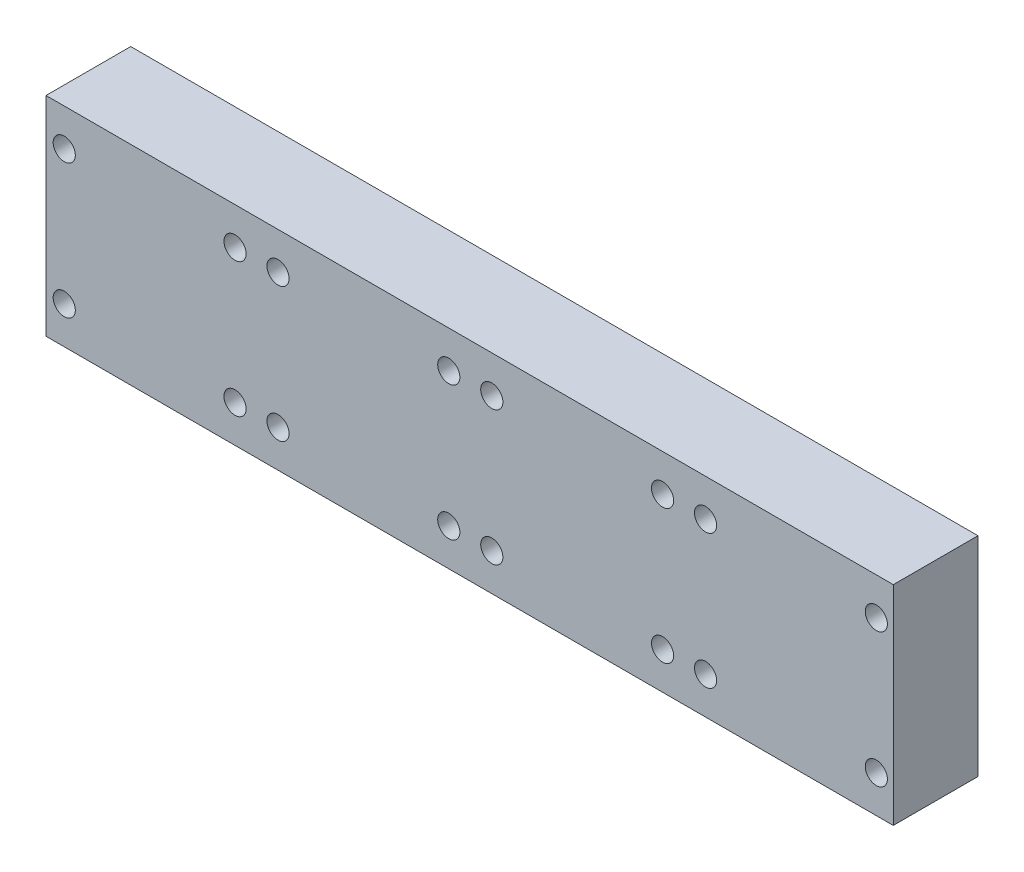
ISO-10303-21;
HEADER;
FILE_DESCRIPTION(('STEP AP214'),'2;1');
FILE_NAME('part.step','',(''),(''),'','','');
FILE_SCHEMA(('AUTOMOTIVE_DESIGN { 1 0 10303 214 1 1 1 1 }'));
ENDSEC;
DATA;
#1=APPLICATION_CONTEXT('core data for automotive mechanical design processes');
#2=APPLICATION_PROTOCOL_DEFINITION('international standard','automotive_design',2000,#1);
#3=PRODUCT_CONTEXT('',#1,'mechanical');
#4=PRODUCT('Part','Part','',(#3));
#5=PRODUCT_RELATED_PRODUCT_CATEGORY('part','',(#4));
#6=PRODUCT_DEFINITION_FORMATION('','',#4);
#7=PRODUCT_DEFINITION_CONTEXT('part definition',#1,'design');
#8=PRODUCT_DEFINITION('design','',#6,#7);
#9=PRODUCT_DEFINITION_SHAPE('','',#8);
#10=(LENGTH_UNIT() NAMED_UNIT(*) SI_UNIT(.MILLI.,.METRE.));
#11=(NAMED_UNIT(*) PLANE_ANGLE_UNIT() SI_UNIT($,.RADIAN.));
#12=(NAMED_UNIT(*) SI_UNIT($,.STERADIAN.) SOLID_ANGLE_UNIT());
#13=UNCERTAINTY_MEASURE_WITH_UNIT(LENGTH_MEASURE(1.E-05),#10,'distance_accuracy_value','');
#14=(GEOMETRIC_REPRESENTATION_CONTEXT(3) GLOBAL_UNCERTAINTY_ASSIGNED_CONTEXT((#13)) GLOBAL_UNIT_ASSIGNED_CONTEXT((#10,
#11,#12)) REPRESENTATION_CONTEXT('',''));
#15=CARTESIAN_POINT('',(0.,0.,0.));
#16=DIRECTION('',(0.,0.,1.));
#17=DIRECTION('',(1.,0.,0.));
#18=AXIS2_PLACEMENT_3D('',#15,#16,#17);
#19=CARTESIAN_POINT('',(127.4,26.3,13.));
#20=DIRECTION('',(0.,0.,1.));
#21=DIRECTION('',(1.,0.,0.));
#22=AXIS2_PLACEMENT_3D('',#19,#20,#21);
#23=CYLINDRICAL_SURFACE('',#22,1.69999999999999);
#24=CARTESIAN_POINT('',(127.4,26.3,0.));
#25=DIRECTION('',(0.,0.,1.));
#26=DIRECTION('',(1.,0.,0.));
#27=AXIS2_PLACEMENT_3D('',#24,#25,#26);
#28=CIRCLE('',#27,1.7);
#29=CARTESIAN_POINT('',(129.1,26.3,0.));
#30=VERTEX_POINT('',#29);
#31=EDGE_CURVE('E48',#30,#30,#28,.T.);
#32=ORIENTED_EDGE('',*,*,#31,.F.);
#33=EDGE_LOOP('',(#32));
#34=FACE_BOUND('',#33,.T.);
#35=CARTESIAN_POINT('',(127.4,26.3,13.));
#36=DIRECTION('',(0.,0.,1.));
#37=DIRECTION('',(1.,0.,0.));
#38=AXIS2_PLACEMENT_3D('',#35,#36,#37);
#39=CIRCLE('',#38,1.69999999999999);
#40=CARTESIAN_POINT('',(129.1,26.3,13.));
#41=VERTEX_POINT('',#40);
#42=EDGE_CURVE('E11',#41,#41,#39,.T.);
#43=ORIENTED_EDGE('',*,*,#42,.T.);
#44=EDGE_LOOP('',(#43));
#45=FACE_BOUND('',#44,.T.);
#46=ADVANCED_FACE('F39',(#34,#45),#23,.F.);
#47=CARTESIAN_POINT('',(94.6,26.3,13.));
#48=DIRECTION('',(0.,0.,1.));
#49=DIRECTION('',(1.,0.,0.));
#50=AXIS2_PLACEMENT_3D('',#47,#48,#49);
#51=CYLINDRICAL_SURFACE('',#50,1.69999999999999);
#52=CARTESIAN_POINT('',(94.6,26.3,0.));
#53=DIRECTION('',(0.,0.,1.));
#54=DIRECTION('',(1.,0.,0.));
#55=AXIS2_PLACEMENT_3D('',#52,#53,#54);
#56=CIRCLE('',#55,1.7);
#57=CARTESIAN_POINT('',(96.3,26.3,0.));
#58=VERTEX_POINT('',#57);
#59=EDGE_CURVE('E177',#58,#58,#56,.T.);
#60=ORIENTED_EDGE('',*,*,#59,.F.);
#61=EDGE_LOOP('',(#60));
#62=FACE_BOUND('',#61,.T.);
#63=CARTESIAN_POINT('',(94.6,26.3,13.));
#64=DIRECTION('',(0.,0.,1.));
#65=DIRECTION('',(1.,0.,0.));
#66=AXIS2_PLACEMENT_3D('',#63,#64,#65);
#67=CIRCLE('',#66,1.69999999999999);
#68=CARTESIAN_POINT('',(96.3,26.3,13.));
#69=VERTEX_POINT('',#68);
#70=EDGE_CURVE('E181',#69,#69,#67,.T.);
#71=ORIENTED_EDGE('',*,*,#70,.T.);
#72=EDGE_LOOP('',(#71));
#73=FACE_BOUND('',#72,.T.);
#74=ADVANCED_FACE('F192',(#62,#73),#51,.F.);
#75=CARTESIAN_POINT('',(101.2,5.7,13.));
#76=DIRECTION('',(0.,0.,1.));
#77=DIRECTION('',(1.,0.,0.));
#78=AXIS2_PLACEMENT_3D('',#75,#76,#77);
#79=CYLINDRICAL_SURFACE('',#78,1.69999999999999);
#80=CARTESIAN_POINT('',(101.2,5.7,0.));
#81=DIRECTION('',(0.,0.,1.));
#82=DIRECTION('',(1.,0.,0.));
#83=AXIS2_PLACEMENT_3D('',#80,#81,#82);
#84=CIRCLE('',#83,1.7);
#85=CARTESIAN_POINT('',(102.9,5.7,0.));
#86=VERTEX_POINT('',#85);
#87=EDGE_CURVE('E169',#86,#86,#84,.T.);
#88=ORIENTED_EDGE('',*,*,#87,.F.);
#89=EDGE_LOOP('',(#88));
#90=FACE_BOUND('',#89,.T.);
#91=CARTESIAN_POINT('',(101.2,5.7,13.));
#92=DIRECTION('',(0.,0.,1.));
#93=DIRECTION('',(1.,0.,0.));
#94=AXIS2_PLACEMENT_3D('',#91,#92,#93);
#95=CIRCLE('',#94,1.69999999999999);
#96=CARTESIAN_POINT('',(102.9,5.7,13.));
#97=VERTEX_POINT('',#96);
#98=EDGE_CURVE('E173',#97,#97,#95,.T.);
#99=ORIENTED_EDGE('',*,*,#98,.T.);
#100=EDGE_LOOP('',(#99));
#101=FACE_BOUND('',#100,.T.);
#102=ADVANCED_FACE('F239',(#90,#101),#79,.F.);
#103=CARTESIAN_POINT('',(68.4,5.7,13.));
#104=DIRECTION('',(0.,0.,1.));
#105=DIRECTION('',(1.,0.,0.));
#106=AXIS2_PLACEMENT_3D('',#103,#104,#105);
#107=CYLINDRICAL_SURFACE('',#106,1.69999999999999);
#108=CARTESIAN_POINT('',(68.4,5.7,0.));
#109=DIRECTION('',(0.,0.,1.));
#110=DIRECTION('',(1.,0.,0.));
#111=AXIS2_PLACEMENT_3D('',#108,#109,#110);
#112=CIRCLE('',#111,1.7);
#113=CARTESIAN_POINT('',(70.1,5.7,0.));
#114=VERTEX_POINT('',#113);
#115=EDGE_CURVE('E161',#114,#114,#112,.T.);
#116=ORIENTED_EDGE('',*,*,#115,.F.);
#117=EDGE_LOOP('',(#116));
#118=FACE_BOUND('',#117,.T.);
#119=CARTESIAN_POINT('',(68.4,5.7,13.));
#120=DIRECTION('',(0.,0.,1.));
#121=DIRECTION('',(1.,0.,0.));
#122=AXIS2_PLACEMENT_3D('',#119,#120,#121);
#123=CIRCLE('',#122,1.69999999999999);
#124=CARTESIAN_POINT('',(70.1,5.7,13.));
#125=VERTEX_POINT('',#124);
#126=EDGE_CURVE('E165',#125,#125,#123,.T.);
#127=ORIENTED_EDGE('',*,*,#126,.T.);
#128=EDGE_LOOP('',(#127));
#129=FACE_BOUND('',#128,.T.);
#130=ADVANCED_FACE('F235',(#118,#129),#107,.F.);
#131=CARTESIAN_POINT('',(127.4,5.7,13.));
#132=DIRECTION('',(0.,0.,1.));
#133=DIRECTION('',(1.,0.,0.));
#134=AXIS2_PLACEMENT_3D('',#131,#132,#133);
#135=CYLINDRICAL_SURFACE('',#134,1.69999999999999);
#136=CARTESIAN_POINT('',(127.4,5.7,0.));
#137=DIRECTION('',(0.,0.,1.));
#138=DIRECTION('',(1.,0.,0.));
#139=AXIS2_PLACEMENT_3D('',#136,#137,#138);
#140=CIRCLE('',#139,1.7);
#141=CARTESIAN_POINT('',(129.1,5.7,0.));
#142=VERTEX_POINT('',#141);
#143=EDGE_CURVE('E153',#142,#142,#140,.T.);
#144=ORIENTED_EDGE('',*,*,#143,.F.);
#145=EDGE_LOOP('',(#144));
#146=FACE_BOUND('',#145,.T.);
#147=CARTESIAN_POINT('',(127.4,5.7,13.));
#148=DIRECTION('',(0.,0.,1.));
#149=DIRECTION('',(1.,0.,0.));
#150=AXIS2_PLACEMENT_3D('',#147,#148,#149);
#151=CIRCLE('',#150,1.69999999999999);
#152=CARTESIAN_POINT('',(129.1,5.7,13.));
#153=VERTEX_POINT('',#152);
#154=EDGE_CURVE('E157',#153,#153,#151,.T.);
#155=ORIENTED_EDGE('',*,*,#154,.T.);
#156=EDGE_LOOP('',(#155));
#157=FACE_BOUND('',#156,.T.);
#158=ADVANCED_FACE('F231',(#146,#157),#135,.F.);
#159=CARTESIAN_POINT('',(94.6,5.7,13.));
#160=DIRECTION('',(0.,0.,1.));
#161=DIRECTION('',(1.,0.,0.));
#162=AXIS2_PLACEMENT_3D('',#159,#160,#161);
#163=CYLINDRICAL_SURFACE('',#162,1.69999999999999);
#164=CARTESIAN_POINT('',(94.6,5.7,0.));
#165=DIRECTION('',(0.,0.,1.));
#166=DIRECTION('',(1.,0.,0.));
#167=AXIS2_PLACEMENT_3D('',#164,#165,#166);
#168=CIRCLE('',#167,1.7);
#169=CARTESIAN_POINT('',(96.3,5.7,0.));
#170=VERTEX_POINT('',#169);
#171=EDGE_CURVE('E145',#170,#170,#168,.T.);
#172=ORIENTED_EDGE('',*,*,#171,.F.);
#173=EDGE_LOOP('',(#172));
#174=FACE_BOUND('',#173,.T.);
#175=CARTESIAN_POINT('',(94.6,5.7,13.));
#176=DIRECTION('',(0.,0.,1.));
#177=DIRECTION('',(1.,0.,0.));
#178=AXIS2_PLACEMENT_3D('',#175,#176,#177);
#179=CIRCLE('',#178,1.69999999999999);
#180=CARTESIAN_POINT('',(96.3,5.7,13.));
#181=VERTEX_POINT('',#180);
#182=EDGE_CURVE('E149',#181,#181,#179,.T.);
#183=ORIENTED_EDGE('',*,*,#182,.T.);
#184=EDGE_LOOP('',(#183));
#185=FACE_BOUND('',#184,.T.);
#186=ADVANCED_FACE('F227',(#174,#185),#163,.F.);
#187=CARTESIAN_POINT('',(101.2,26.3,13.));
#188=DIRECTION('',(0.,0.,1.));
#189=DIRECTION('',(1.,0.,0.));
#190=AXIS2_PLACEMENT_3D('',#187,#188,#189);
#191=CYLINDRICAL_SURFACE('',#190,1.69999999999999);
#192=CARTESIAN_POINT('',(101.2,26.3,0.));
#193=DIRECTION('',(0.,0.,1.));
#194=DIRECTION('',(1.,0.,0.));
#195=AXIS2_PLACEMENT_3D('',#192,#193,#194);
#196=CIRCLE('',#195,1.7);
#197=CARTESIAN_POINT('',(102.9,26.3,0.));
#198=VERTEX_POINT('',#197);
#199=EDGE_CURVE('E137',#198,#198,#196,.T.);
#200=ORIENTED_EDGE('',*,*,#199,.F.);
#201=EDGE_LOOP('',(#200));
#202=FACE_BOUND('',#201,.T.);
#203=CARTESIAN_POINT('',(101.2,26.3,13.));
#204=DIRECTION('',(0.,0.,1.));
#205=DIRECTION('',(1.,0.,0.));
#206=AXIS2_PLACEMENT_3D('',#203,#204,#205);
#207=CIRCLE('',#206,1.69999999999999);
#208=CARTESIAN_POINT('',(102.9,26.3,13.));
#209=VERTEX_POINT('',#208);
#210=EDGE_CURVE('E141',#209,#209,#207,.T.);
#211=ORIENTED_EDGE('',*,*,#210,.T.);
#212=EDGE_LOOP('',(#211));
#213=FACE_BOUND('',#212,.T.);
#214=ADVANCED_FACE('F206',(#202,#213),#191,.F.);
#215=CARTESIAN_POINT('',(68.4,26.3,13.));
#216=DIRECTION('',(0.,0.,1.));
#217=DIRECTION('',(1.,0.,0.));
#218=AXIS2_PLACEMENT_3D('',#215,#216,#217);
#219=CYLINDRICAL_SURFACE('',#218,1.69999999999999);
#220=CARTESIAN_POINT('',(68.4,26.3,0.));
#221=DIRECTION('',(0.,0.,1.));
#222=DIRECTION('',(1.,0.,0.));
#223=AXIS2_PLACEMENT_3D('',#220,#221,#222);
#224=CIRCLE('',#223,1.7);
#225=CARTESIAN_POINT('',(70.1,26.3,0.));
#226=VERTEX_POINT('',#225);
#227=EDGE_CURVE('E129',#226,#226,#224,.T.);
#228=ORIENTED_EDGE('',*,*,#227,.F.);
#229=EDGE_LOOP('',(#228));
#230=FACE_BOUND('',#229,.T.);
#231=CARTESIAN_POINT('',(68.4,26.3,13.));
#232=DIRECTION('',(0.,0.,1.));
#233=DIRECTION('',(1.,0.,0.));
#234=AXIS2_PLACEMENT_3D('',#231,#232,#233);
#235=CIRCLE('',#234,1.69999999999999);
#236=CARTESIAN_POINT('',(70.1,26.3,13.));
#237=VERTEX_POINT('',#236);
#238=EDGE_CURVE('E133',#237,#237,#235,.T.);
#239=ORIENTED_EDGE('',*,*,#238,.T.);
#240=EDGE_LOOP('',(#239));
#241=FACE_BOUND('',#240,.T.);
#242=ADVANCED_FACE('F196',(#230,#241),#219,.F.);
#243=CARTESIAN_POINT('',(0.,0.,13.));
#244=DIRECTION('',(0.,0.,-1.));
#245=DIRECTION('',(-1.,0.,0.));
#246=AXIS2_PLACEMENT_3D('',#243,#244,#245);
#247=PLANE('',#246);
#248=CARTESIAN_POINT('',(61.8,26.3,13.));
#249=DIRECTION('',(0.,0.,1.));
#250=DIRECTION('',(1.,0.,0.));
#251=AXIS2_PLACEMENT_3D('',#248,#249,#250);
#252=CIRCLE('',#251,1.69999999999999);
#253=CARTESIAN_POINT('',(63.5,26.3,13.));
#254=VERTEX_POINT('',#253);
#255=EDGE_CURVE('E452',#254,#254,#252,.T.);
#256=ORIENTED_EDGE('',*,*,#255,.F.);
#257=EDGE_LOOP('',(#256));
#258=FACE_BOUND('',#257,.T.);
#259=CARTESIAN_POINT('',(35.6,5.7,13.));
#260=DIRECTION('',(0.,0.,1.));
#261=DIRECTION('',(1.,0.,0.));
#262=AXIS2_PLACEMENT_3D('',#259,#260,#261);
#263=CIRCLE('',#262,1.69999999999999);
#264=CARTESIAN_POINT('',(37.3,5.7,13.));
#265=VERTEX_POINT('',#264);
#266=EDGE_CURVE('E444',#265,#265,#263,.T.);
#267=ORIENTED_EDGE('',*,*,#266,.F.);
#268=EDGE_LOOP('',(#267));
#269=FACE_BOUND('',#268,.T.);
#270=CARTESIAN_POINT('',(61.8,5.7,13.));
#271=DIRECTION('',(0.,0.,1.));
#272=DIRECTION('',(1.,0.,0.));
#273=AXIS2_PLACEMENT_3D('',#270,#271,#272);
#274=CIRCLE('',#273,1.69999999999999);
#275=CARTESIAN_POINT('',(63.5,5.7,13.));
#276=VERTEX_POINT('',#275);
#277=EDGE_CURVE('E436',#276,#276,#274,.T.);
#278=ORIENTED_EDGE('',*,*,#277,.F.);
#279=EDGE_LOOP('',(#278));
#280=FACE_BOUND('',#279,.T.);
#281=CARTESIAN_POINT('',(35.6,26.3,13.));
#282=DIRECTION('',(0.,0.,1.));
#283=DIRECTION('',(1.,0.,0.));
#284=AXIS2_PLACEMENT_3D('',#281,#282,#283);
#285=CIRCLE('',#284,1.69999999999999);
#286=CARTESIAN_POINT('',(37.3,26.3,13.));
#287=VERTEX_POINT('',#286);
#288=EDGE_CURVE('E428',#287,#287,#285,.T.);
#289=ORIENTED_EDGE('',*,*,#288,.F.);
#290=EDGE_LOOP('',(#289));
#291=FACE_BOUND('',#290,.T.);
#292=CARTESIAN_POINT('',(2.8,26.3,13.));
#293=DIRECTION('',(0.,0.,1.));
#294=DIRECTION('',(1.,0.,0.));
#295=AXIS2_PLACEMENT_3D('',#292,#293,#294);
#296=CIRCLE('',#295,1.69999999999999);
#297=CARTESIAN_POINT('',(4.49999999999999,26.3,13.));
#298=VERTEX_POINT('',#297);
#299=EDGE_CURVE('E422',#298,#298,#296,.T.);
#300=ORIENTED_EDGE('',*,*,#299,.F.);
#301=EDGE_LOOP('',(#300));
#302=FACE_BOUND('',#301,.T.);
#303=CARTESIAN_POINT('',(29.,5.7,13.));
#304=DIRECTION('',(0.,0.,1.));
#305=DIRECTION('',(1.,0.,0.));
#306=AXIS2_PLACEMENT_3D('',#303,#304,#305);
#307=CIRCLE('',#306,1.69999999999999);
#308=CARTESIAN_POINT('',(30.7,5.7,13.));
#309=VERTEX_POINT('',#308);
#310=EDGE_CURVE('E363',#309,#309,#307,.T.);
#311=ORIENTED_EDGE('',*,*,#310,.F.);
#312=EDGE_LOOP('',(#311));
#313=FACE_BOUND('',#312,.T.);
#314=DIRECTION('',(0.,-1.,0.));
#315=VECTOR('',#314,1.);
#316=CARTESIAN_POINT('',(0.,0.,13.));
#317=LINE('',#316,#315);
#318=CARTESIAN_POINT('',(0.,32.,13.));
#319=VERTEX_POINT('',#318);
#320=CARTESIAN_POINT('',(0.,0.,13.));
#321=VERTEX_POINT('',#320);
#322=EDGE_CURVE('E93',#319,#321,#317,.T.);
#323=ORIENTED_EDGE('',*,*,#322,.T.);
#324=DIRECTION('',(1.,0.,0.));
#325=VECTOR('',#324,1.);
#326=CARTESIAN_POINT('',(0.,0.,13.));
#327=LINE('',#326,#325);
#328=CARTESIAN_POINT('',(130.,0.,13.));
#329=VERTEX_POINT('',#328);
#330=EDGE_CURVE('E87',#321,#329,#327,.T.);
#331=ORIENTED_EDGE('',*,*,#330,.T.);
#332=DIRECTION('',(0.,1.,0.));
#333=VECTOR('',#332,1.);
#334=CARTESIAN_POINT('',(130.,0.,13.));
#335=LINE('',#334,#333);
#336=CARTESIAN_POINT('',(130.,32.,13.));
#337=VERTEX_POINT('',#336);
#338=EDGE_CURVE('E91',#329,#337,#335,.T.);
#339=ORIENTED_EDGE('',*,*,#338,.T.);
#340=DIRECTION('',(-1.,0.,0.));
#341=VECTOR('',#340,1.);
#342=CARTESIAN_POINT('',(0.,32.,13.));
#343=LINE('',#342,#341);
#344=EDGE_CURVE('E56',#337,#319,#343,.T.);
#345=ORIENTED_EDGE('',*,*,#344,.T.);
#346=EDGE_LOOP('',(#323,#331,#339,#345));
#347=FACE_BOUND('',#346,.T.);
#348=CARTESIAN_POINT('',(2.8,5.7,13.));
#349=DIRECTION('',(0.,0.,1.));
#350=DIRECTION('',(1.,0.,0.));
#351=AXIS2_PLACEMENT_3D('',#348,#349,#350);
#352=CIRCLE('',#351,1.69999999999999);
#353=CARTESIAN_POINT('',(4.49999999999999,5.7,13.));
#354=VERTEX_POINT('',#353);
#355=EDGE_CURVE('E357',#354,#354,#352,.T.);
#356=ORIENTED_EDGE('',*,*,#355,.F.);
#357=EDGE_LOOP('',(#356));
#358=FACE_BOUND('',#357,.T.);
#359=CARTESIAN_POINT('',(29.,26.3,13.));
#360=DIRECTION('',(0.,0.,1.));
#361=DIRECTION('',(1.,0.,0.));
#362=AXIS2_PLACEMENT_3D('',#359,#360,#361);
#363=CIRCLE('',#362,1.69999999999999);
#364=CARTESIAN_POINT('',(30.7,26.3,13.));
#365=VERTEX_POINT('',#364);
#366=EDGE_CURVE('E366',#365,#365,#363,.T.);
#367=ORIENTED_EDGE('',*,*,#366,.F.);
#368=EDGE_LOOP('',(#367));
#369=FACE_BOUND('',#368,.T.);
#370=ORIENTED_EDGE('',*,*,#238,.F.);
#371=EDGE_LOOP('',(#370));
#372=FACE_BOUND('',#371,.T.);
#373=ORIENTED_EDGE('',*,*,#210,.F.);
#374=EDGE_LOOP('',(#373));
#375=FACE_BOUND('',#374,.T.);
#376=ORIENTED_EDGE('',*,*,#182,.F.);
#377=EDGE_LOOP('',(#376));
#378=FACE_BOUND('',#377,.T.);
#379=ORIENTED_EDGE('',*,*,#154,.F.);
#380=EDGE_LOOP('',(#379));
#381=FACE_BOUND('',#380,.T.);
#382=ORIENTED_EDGE('',*,*,#126,.F.);
#383=EDGE_LOOP('',(#382));
#384=FACE_BOUND('',#383,.T.);
#385=ORIENTED_EDGE('',*,*,#98,.F.);
#386=EDGE_LOOP('',(#385));
#387=FACE_BOUND('',#386,.T.);
#388=ORIENTED_EDGE('',*,*,#70,.F.);
#389=EDGE_LOOP('',(#388));
#390=FACE_BOUND('',#389,.T.);
#391=ORIENTED_EDGE('',*,*,#42,.F.);
#392=EDGE_LOOP('',(#391));
#393=FACE_BOUND('',#392,.T.);
#394=ADVANCED_FACE('F88',(#258,#269,#280,#291,#302,#313,#347,#358,#369,#372,#375,#378,#381,#384,
#387,#390,#393),#247,.F.);
#395=CARTESIAN_POINT('',(0.,0.,0.));
#396=DIRECTION('',(0.,0.,-1.));
#397=DIRECTION('',(-1.,0.,0.));
#398=AXIS2_PLACEMENT_3D('',#395,#396,#397);
#399=PLANE('',#398);
#400=CARTESIAN_POINT('',(61.8,26.3,0.));
#401=DIRECTION('',(0.,0.,1.));
#402=DIRECTION('',(1.,0.,0.));
#403=AXIS2_PLACEMENT_3D('',#400,#401,#402);
#404=CIRCLE('',#403,1.7);
#405=CARTESIAN_POINT('',(63.5,26.3,0.));
#406=VERTEX_POINT('',#405);
#407=EDGE_CURVE('E456',#406,#406,#404,.T.);
#408=ORIENTED_EDGE('',*,*,#407,.T.);
#409=EDGE_LOOP('',(#408));
#410=FACE_BOUND('',#409,.T.);
#411=CARTESIAN_POINT('',(35.6,5.7,0.));
#412=DIRECTION('',(0.,0.,1.));
#413=DIRECTION('',(1.,0.,0.));
#414=AXIS2_PLACEMENT_3D('',#411,#412,#413);
#415=CIRCLE('',#414,1.7);
#416=CARTESIAN_POINT('',(37.3,5.7,0.));
#417=VERTEX_POINT('',#416);
#418=EDGE_CURVE('E448',#417,#417,#415,.T.);
#419=ORIENTED_EDGE('',*,*,#418,.T.);
#420=EDGE_LOOP('',(#419));
#421=FACE_BOUND('',#420,.T.);
#422=CARTESIAN_POINT('',(61.8,5.7,0.));
#423=DIRECTION('',(0.,0.,1.));
#424=DIRECTION('',(1.,0.,0.));
#425=AXIS2_PLACEMENT_3D('',#422,#423,#424);
#426=CIRCLE('',#425,1.7);
#427=CARTESIAN_POINT('',(63.5,5.7,0.));
#428=VERTEX_POINT('',#427);
#429=EDGE_CURVE('E440',#428,#428,#426,.T.);
#430=ORIENTED_EDGE('',*,*,#429,.T.);
#431=EDGE_LOOP('',(#430));
#432=FACE_BOUND('',#431,.T.);
#433=CARTESIAN_POINT('',(35.6,26.3,0.));
#434=DIRECTION('',(0.,0.,1.));
#435=DIRECTION('',(1.,0.,0.));
#436=AXIS2_PLACEMENT_3D('',#433,#434,#435);
#437=CIRCLE('',#436,1.7);
#438=CARTESIAN_POINT('',(37.3,26.3,0.));
#439=VERTEX_POINT('',#438);
#440=EDGE_CURVE('E432',#439,#439,#437,.T.);
#441=ORIENTED_EDGE('',*,*,#440,.T.);
#442=EDGE_LOOP('',(#441));
#443=FACE_BOUND('',#442,.T.);
#444=CARTESIAN_POINT('',(2.8,26.3,0.));
#445=DIRECTION('',(0.,0.,1.));
#446=DIRECTION('',(1.,0.,0.));
#447=AXIS2_PLACEMENT_3D('',#444,#445,#446);
#448=CIRCLE('',#447,1.7);
#449=CARTESIAN_POINT('',(4.5,26.3,0.));
#450=VERTEX_POINT('',#449);
#451=EDGE_CURVE('E419',#450,#450,#448,.T.);
#452=ORIENTED_EDGE('',*,*,#451,.T.);
#453=EDGE_LOOP('',(#452));
#454=FACE_BOUND('',#453,.T.);
#455=DIRECTION('',(0.,-1.,0.));
#456=VECTOR('',#455,1.);
#457=CARTESIAN_POINT('',(0.,0.,0.));
#458=LINE('',#457,#456);
#459=CARTESIAN_POINT('',(0.,32.,0.));
#460=VERTEX_POINT('',#459);
#461=CARTESIAN_POINT('',(0.,0.,0.));
#462=VERTEX_POINT('',#461);
#463=EDGE_CURVE('E112',#460,#462,#458,.T.);
#464=ORIENTED_EDGE('',*,*,#463,.F.);
#465=DIRECTION('',(-1.,0.,0.));
#466=VECTOR('',#465,1.);
#467=CARTESIAN_POINT('',(0.,32.,0.));
#468=LINE('',#467,#466);
#469=CARTESIAN_POINT('',(130.,32.,0.));
#470=VERTEX_POINT('',#469);
#471=EDGE_CURVE('E79',#470,#460,#468,.T.);
#472=ORIENTED_EDGE('',*,*,#471,.F.);
#473=DIRECTION('',(0.,1.,0.));
#474=VECTOR('',#473,1.);
#475=CARTESIAN_POINT('',(130.,0.,0.));
#476=LINE('',#475,#474);
#477=CARTESIAN_POINT('',(130.,0.,0.));
#478=VERTEX_POINT('',#477);
#479=EDGE_CURVE('E73',#478,#470,#476,.T.);
#480=ORIENTED_EDGE('',*,*,#479,.F.);
#481=DIRECTION('',(1.,0.,0.));
#482=VECTOR('',#481,1.);
#483=CARTESIAN_POINT('',(0.,0.,0.));
#484=LINE('',#483,#482);
#485=EDGE_CURVE('E99',#462,#478,#484,.T.);
#486=ORIENTED_EDGE('',*,*,#485,.F.);
#487=EDGE_LOOP('',(#464,#472,#480,#486));
#488=FACE_BOUND('',#487,.T.);
#489=CARTESIAN_POINT('',(29.,5.7,0.));
#490=DIRECTION('',(0.,0.,1.));
#491=DIRECTION('',(1.,0.,0.));
#492=AXIS2_PLACEMENT_3D('',#489,#490,#491);
#493=CIRCLE('',#492,1.7);
#494=CARTESIAN_POINT('',(30.7,5.7,0.));
#495=VERTEX_POINT('',#494);
#496=EDGE_CURVE('E116',#495,#495,#493,.T.);
#497=ORIENTED_EDGE('',*,*,#496,.T.);
#498=EDGE_LOOP('',(#497));
#499=FACE_BOUND('',#498,.T.);
#500=CARTESIAN_POINT('',(2.8,5.7,0.));
#501=DIRECTION('',(0.,0.,1.));
#502=DIRECTION('',(1.,0.,0.));
#503=AXIS2_PLACEMENT_3D('',#500,#501,#502);
#504=CIRCLE('',#503,1.7);
#505=CARTESIAN_POINT('',(4.5,5.7,0.));
#506=VERTEX_POINT('',#505);
#507=EDGE_CURVE('E354',#506,#506,#504,.T.);
#508=ORIENTED_EDGE('',*,*,#507,.T.);
#509=EDGE_LOOP('',(#508));
#510=FACE_BOUND('',#509,.T.);
#511=CARTESIAN_POINT('',(29.,26.3,0.));
#512=DIRECTION('',(0.,0.,1.));
#513=DIRECTION('',(1.,0.,0.));
#514=AXIS2_PLACEMENT_3D('',#511,#512,#513);
#515=CIRCLE('',#514,1.7);
#516=CARTESIAN_POINT('',(30.7,26.3,0.));
#517=VERTEX_POINT('',#516);
#518=EDGE_CURVE('E359',#517,#517,#515,.T.);
#519=ORIENTED_EDGE('',*,*,#518,.T.);
#520=EDGE_LOOP('',(#519));
#521=FACE_BOUND('',#520,.T.);
#522=ORIENTED_EDGE('',*,*,#227,.T.);
#523=EDGE_LOOP('',(#522));
#524=FACE_BOUND('',#523,.T.);
#525=ORIENTED_EDGE('',*,*,#199,.T.);
#526=EDGE_LOOP('',(#525));
#527=FACE_BOUND('',#526,.T.);
#528=ORIENTED_EDGE('',*,*,#171,.T.);
#529=EDGE_LOOP('',(#528));
#530=FACE_BOUND('',#529,.T.);
#531=ORIENTED_EDGE('',*,*,#143,.T.);
#532=EDGE_LOOP('',(#531));
#533=FACE_BOUND('',#532,.T.);
#534=ORIENTED_EDGE('',*,*,#115,.T.);
#535=EDGE_LOOP('',(#534));
#536=FACE_BOUND('',#535,.T.);
#537=ORIENTED_EDGE('',*,*,#87,.T.);
#538=EDGE_LOOP('',(#537));
#539=FACE_BOUND('',#538,.T.);
#540=ORIENTED_EDGE('',*,*,#59,.T.);
#541=EDGE_LOOP('',(#540));
#542=FACE_BOUND('',#541,.T.);
#543=ORIENTED_EDGE('',*,*,#31,.T.);
#544=EDGE_LOOP('',(#543));
#545=FACE_BOUND('',#544,.T.);
#546=ADVANCED_FACE('F188',(#410,#421,#432,#443,#454,#488,#499,#510,#521,#524,#527,#530,#533,
#536,#539,#542,#545),#399,.T.);
#547=CARTESIAN_POINT('',(0.,0.,13.));
#548=DIRECTION('',(1.,0.,0.));
#549=DIRECTION('',(0.,0.,-1.));
#550=AXIS2_PLACEMENT_3D('',#547,#548,#549);
#551=PLANE('',#550);
#552=ORIENTED_EDGE('',*,*,#463,.T.);
#553=DIRECTION('',(0.,0.,-1.));
#554=VECTOR('',#553,1.);
#555=CARTESIAN_POINT('',(0.,0.,13.));
#556=LINE('',#555,#554);
#557=EDGE_CURVE('E101',#321,#462,#556,.T.);
#558=ORIENTED_EDGE('',*,*,#557,.F.);
#559=ORIENTED_EDGE('',*,*,#322,.F.);
#560=DIRECTION('',(0.,0.,-1.));
#561=VECTOR('',#560,1.);
#562=CARTESIAN_POINT('',(0.,32.,13.));
#563=LINE('',#562,#561);
#564=EDGE_CURVE('E108',#319,#460,#563,.T.);
#565=ORIENTED_EDGE('',*,*,#564,.T.);
#566=EDGE_LOOP('',(#552,#558,#559,#565));
#567=FACE_BOUND('',#566,.T.);
#568=ADVANCED_FACE('F203',(#567),#551,.F.);
#569=CARTESIAN_POINT('',(0.,0.,13.));
#570=DIRECTION('',(0.,1.,0.));
#571=DIRECTION('',(0.,0.,1.));
#572=AXIS2_PLACEMENT_3D('',#569,#570,#571);
#573=PLANE('',#572);
#574=ORIENTED_EDGE('',*,*,#485,.T.);
#575=DIRECTION('',(0.,0.,-1.));
#576=VECTOR('',#575,1.);
#577=CARTESIAN_POINT('',(130.,0.,13.));
#578=LINE('',#577,#576);
#579=EDGE_CURVE('E97',#329,#478,#578,.T.);
#580=ORIENTED_EDGE('',*,*,#579,.F.);
#581=ORIENTED_EDGE('',*,*,#330,.F.);
#582=ORIENTED_EDGE('',*,*,#557,.T.);
#583=EDGE_LOOP('',(#574,#580,#581,#582));
#584=FACE_BOUND('',#583,.T.);
#585=ADVANCED_FACE('F98',(#584),#573,.F.);
#586=CARTESIAN_POINT('',(130.,0.,13.));
#587=DIRECTION('',(-1.,0.,0.));
#588=DIRECTION('',(0.,0.,1.));
#589=AXIS2_PLACEMENT_3D('',#586,#587,#588);
#590=PLANE('',#589);
#591=ORIENTED_EDGE('',*,*,#479,.T.);
#592=DIRECTION('',(0.,0.,-1.));
#593=VECTOR('',#592,1.);
#594=CARTESIAN_POINT('',(130.,32.,13.));
#595=LINE('',#594,#593);
#596=EDGE_CURVE('E102',#337,#470,#595,.T.);
#597=ORIENTED_EDGE('',*,*,#596,.F.);
#598=ORIENTED_EDGE('',*,*,#338,.F.);
#599=ORIENTED_EDGE('',*,*,#579,.T.);
#600=EDGE_LOOP('',(#591,#597,#598,#599));
#601=FACE_BOUND('',#600,.T.);
#602=ADVANCED_FACE('F104',(#601),#590,.F.);
#603=CARTESIAN_POINT('',(0.,32.,13.));
#604=DIRECTION('',(0.,-1.,0.));
#605=DIRECTION('',(0.,0.,-1.));
#606=AXIS2_PLACEMENT_3D('',#603,#604,#605);
#607=PLANE('',#606);
#608=ORIENTED_EDGE('',*,*,#471,.T.);
#609=ORIENTED_EDGE('',*,*,#564,.F.);
#610=ORIENTED_EDGE('',*,*,#344,.F.);
#611=ORIENTED_EDGE('',*,*,#596,.T.);
#612=EDGE_LOOP('',(#608,#609,#610,#611));
#613=FACE_BOUND('',#612,.T.);
#614=ADVANCED_FACE('F215',(#613),#607,.F.);
#615=CARTESIAN_POINT('',(29.,5.7,13.));
#616=DIRECTION('',(0.,0.,1.));
#617=DIRECTION('',(1.,0.,0.));
#618=AXIS2_PLACEMENT_3D('',#615,#616,#617);
#619=CYLINDRICAL_SURFACE('',#618,1.69999999999999);
#620=ORIENTED_EDGE('',*,*,#496,.F.);
#621=EDGE_LOOP('',(#620));
#622=FACE_BOUND('',#621,.T.);
#623=ORIENTED_EDGE('',*,*,#310,.T.);
#624=EDGE_LOOP('',(#623));
#625=FACE_BOUND('',#624,.T.);
#626=ADVANCED_FACE('F212',(#622,#625),#619,.F.);
#627=CARTESIAN_POINT('',(2.8,5.7,13.));
#628=DIRECTION('',(0.,0.,1.));
#629=DIRECTION('',(1.,0.,0.));
#630=AXIS2_PLACEMENT_3D('',#627,#628,#629);
#631=CYLINDRICAL_SURFACE('',#630,1.69999999999999);
#632=ORIENTED_EDGE('',*,*,#507,.F.);
#633=EDGE_LOOP('',(#632));
#634=FACE_BOUND('',#633,.T.);
#635=ORIENTED_EDGE('',*,*,#355,.T.);
#636=EDGE_LOOP('',(#635));
#637=FACE_BOUND('',#636,.T.);
#638=ADVANCED_FACE('F343',(#634,#637),#631,.F.);
#639=CARTESIAN_POINT('',(29.,26.3,13.));
#640=DIRECTION('',(0.,0.,1.));
#641=DIRECTION('',(1.,0.,0.));
#642=AXIS2_PLACEMENT_3D('',#639,#640,#641);
#643=CYLINDRICAL_SURFACE('',#642,1.69999999999999);
#644=ORIENTED_EDGE('',*,*,#518,.F.);
#645=EDGE_LOOP('',(#644));
#646=FACE_BOUND('',#645,.T.);
#647=ORIENTED_EDGE('',*,*,#366,.T.);
#648=EDGE_LOOP('',(#647));
#649=FACE_BOUND('',#648,.T.);
#650=ADVANCED_FACE('F340',(#646,#649),#643,.F.);
#651=CARTESIAN_POINT('',(2.8,26.3,13.));
#652=DIRECTION('',(0.,0.,1.));
#653=DIRECTION('',(1.,0.,0.));
#654=AXIS2_PLACEMENT_3D('',#651,#652,#653);
#655=CYLINDRICAL_SURFACE('',#654,1.69999999999999);
#656=ORIENTED_EDGE('',*,*,#451,.F.);
#657=EDGE_LOOP('',(#656));
#658=FACE_BOUND('',#657,.T.);
#659=ORIENTED_EDGE('',*,*,#299,.T.);
#660=EDGE_LOOP('',(#659));
#661=FACE_BOUND('',#660,.T.);
#662=ADVANCED_FACE('F301',(#658,#661),#655,.F.);
#663=CARTESIAN_POINT('',(35.6,26.3,13.));
#664=DIRECTION('',(0.,0.,1.));
#665=DIRECTION('',(1.,0.,0.));
#666=AXIS2_PLACEMENT_3D('',#663,#664,#665);
#667=CYLINDRICAL_SURFACE('',#666,1.69999999999999);
#668=ORIENTED_EDGE('',*,*,#440,.F.);
#669=EDGE_LOOP('',(#668));
#670=FACE_BOUND('',#669,.T.);
#671=ORIENTED_EDGE('',*,*,#288,.T.);
#672=EDGE_LOOP('',(#671));
#673=FACE_BOUND('',#672,.T.);
#674=ADVANCED_FACE('F296',(#670,#673),#667,.F.);
#675=CARTESIAN_POINT('',(61.8,5.7,13.));
#676=DIRECTION('',(0.,0.,1.));
#677=DIRECTION('',(1.,0.,0.));
#678=AXIS2_PLACEMENT_3D('',#675,#676,#677);
#679=CYLINDRICAL_SURFACE('',#678,1.69999999999999);
#680=ORIENTED_EDGE('',*,*,#429,.F.);
#681=EDGE_LOOP('',(#680));
#682=FACE_BOUND('',#681,.T.);
#683=ORIENTED_EDGE('',*,*,#277,.T.);
#684=EDGE_LOOP('',(#683));
#685=FACE_BOUND('',#684,.T.);
#686=ADVANCED_FACE('F300',(#682,#685),#679,.F.);
#687=CARTESIAN_POINT('',(35.6,5.7,13.));
#688=DIRECTION('',(0.,0.,1.));
#689=DIRECTION('',(1.,0.,0.));
#690=AXIS2_PLACEMENT_3D('',#687,#688,#689);
#691=CYLINDRICAL_SURFACE('',#690,1.69999999999999);
#692=ORIENTED_EDGE('',*,*,#418,.F.);
#693=EDGE_LOOP('',(#692));
#694=FACE_BOUND('',#693,.T.);
#695=ORIENTED_EDGE('',*,*,#266,.T.);
#696=EDGE_LOOP('',(#695));
#697=FACE_BOUND('',#696,.T.);
#698=ADVANCED_FACE('F312',(#694,#697),#691,.F.);
#699=CARTESIAN_POINT('',(61.8,26.3,13.));
#700=DIRECTION('',(0.,0.,1.));
#701=DIRECTION('',(1.,0.,0.));
#702=AXIS2_PLACEMENT_3D('',#699,#700,#701);
#703=CYLINDRICAL_SURFACE('',#702,1.69999999999999);
#704=ORIENTED_EDGE('',*,*,#407,.F.);
#705=EDGE_LOOP('',(#704));
#706=FACE_BOUND('',#705,.T.);
#707=ORIENTED_EDGE('',*,*,#255,.T.);
#708=EDGE_LOOP('',(#707));
#709=FACE_BOUND('',#708,.T.);
#710=ADVANCED_FACE('F322',(#706,#709),#703,.F.);
#711=CLOSED_SHELL('',(#46,#74,#102,#130,#158,#186,#214,#242,#394,#546,#568,#585,#602,#614,#626,
#638,#650,#662,#674,#686,#698,#710));
#712=MANIFOLD_SOLID_BREP('B2',#711);
#713=ADVANCED_BREP_SHAPE_REPRESENTATION('',(#18,#712),#14);
#714=SHAPE_DEFINITION_REPRESENTATION(#9,#713);
ENDSEC;
END-ISO-10303-21;
